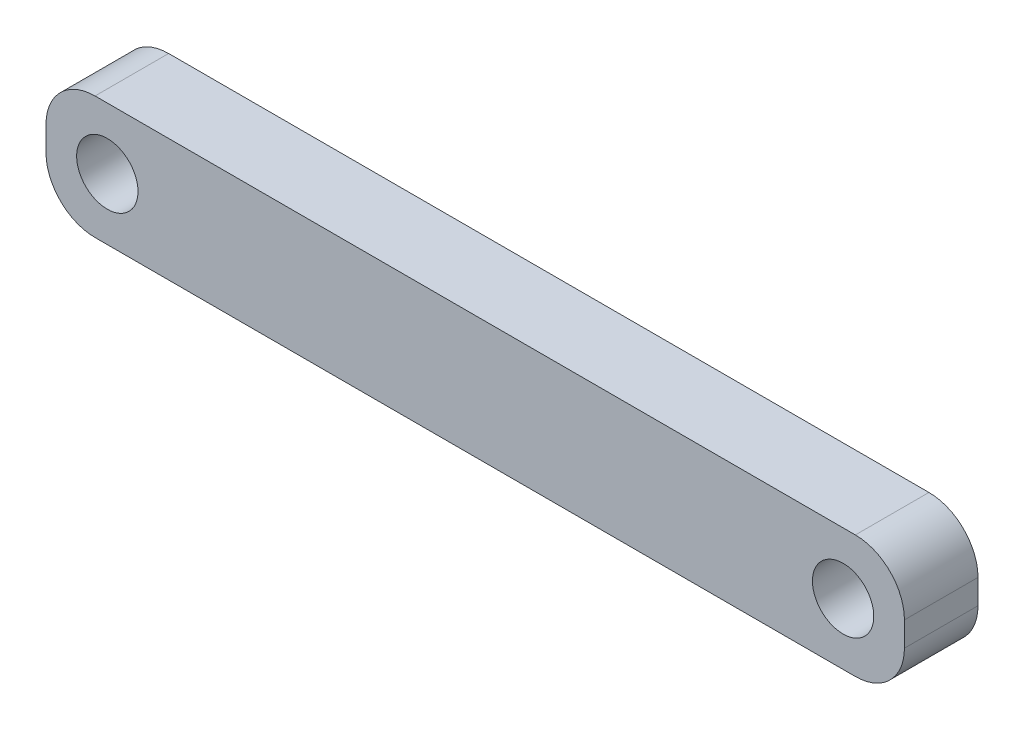
ISO-10303-21;
HEADER;
FILE_DESCRIPTION(('STEP AP214'),'2;1');
FILE_NAME('part.step','',(''),(''),'','','');
FILE_SCHEMA(('AUTOMOTIVE_DESIGN { 1 0 10303 214 1 1 1 1 }'));
ENDSEC;
DATA;
#1=APPLICATION_CONTEXT('core data for automotive mechanical design processes');
#2=APPLICATION_PROTOCOL_DEFINITION('international standard','automotive_design',2000,#1);
#3=PRODUCT_CONTEXT('',#1,'mechanical');
#4=PRODUCT('Part','Part','',(#3));
#5=PRODUCT_RELATED_PRODUCT_CATEGORY('part','',(#4));
#6=PRODUCT_DEFINITION_FORMATION('','',#4);
#7=PRODUCT_DEFINITION_CONTEXT('part definition',#1,'design');
#8=PRODUCT_DEFINITION('design','',#6,#7);
#9=PRODUCT_DEFINITION_SHAPE('','',#8);
#10=(LENGTH_UNIT() NAMED_UNIT(*) SI_UNIT(.MILLI.,.METRE.));
#11=(NAMED_UNIT(*) PLANE_ANGLE_UNIT() SI_UNIT($,.RADIAN.));
#12=(NAMED_UNIT(*) SI_UNIT($,.STERADIAN.) SOLID_ANGLE_UNIT());
#13=UNCERTAINTY_MEASURE_WITH_UNIT(LENGTH_MEASURE(1.E-05),#10,'distance_accuracy_value','');
#14=(GEOMETRIC_REPRESENTATION_CONTEXT(3) GLOBAL_UNCERTAINTY_ASSIGNED_CONTEXT((#13)) GLOBAL_UNIT_ASSIGNED_CONTEXT((#10,
#11,#12)) REPRESENTATION_CONTEXT('',''));
#15=CARTESIAN_POINT('',(0.,0.,0.));
#16=DIRECTION('',(0.,0.,1.));
#17=DIRECTION('',(1.,0.,0.));
#18=AXIS2_PLACEMENT_3D('',#15,#16,#17);
#19=CARTESIAN_POINT('',(31.,-1.,6.));
#20=DIRECTION('',(0.,0.,1.));
#21=DIRECTION('',(1.,0.,0.));
#22=AXIS2_PLACEMENT_3D('',#19,#20,#21);
#23=PLANE('',#22);
#24=CARTESIAN_POINT('',(-30.,0.,6.));
#25=DIRECTION('',(0.,0.,1.));
#26=DIRECTION('',(1.,0.,0.));
#27=AXIS2_PLACEMENT_3D('',#24,#25,#26);
#28=CIRCLE('',#27,2.5);
#29=CARTESIAN_POINT('',(-27.5,0.,6.));
#30=VERTEX_POINT('',#29);
#31=EDGE_CURVE('E140',#30,#30,#28,.T.);
#32=ORIENTED_EDGE('',*,*,#31,.F.);
#33=EDGE_LOOP('',(#32));
#34=FACE_BOUND('',#33,.T.);
#35=CARTESIAN_POINT('',(31.,-1.,6.));
#36=DIRECTION('',(0.,0.,1.));
#37=DIRECTION('',(1.,0.,0.));
#38=AXIS2_PLACEMENT_3D('',#35,#36,#37);
#39=CIRCLE('',#38,4.);
#40=CARTESIAN_POINT('',(31.,-5.,6.));
#41=VERTEX_POINT('',#40);
#42=CARTESIAN_POINT('',(35.,-0.999999999999974,6.));
#43=VERTEX_POINT('',#42);
#44=EDGE_CURVE('E151',#41,#43,#39,.T.);
#45=ORIENTED_EDGE('',*,*,#44,.T.);
#46=DIRECTION('',(0.,1.,0.));
#47=VECTOR('',#46,1.);
#48=CARTESIAN_POINT('',(35.,0.999999999999971,6.));
#49=LINE('',#48,#47);
#50=CARTESIAN_POINT('',(35.,0.999999999999972,6.));
#51=VERTEX_POINT('',#50);
#52=EDGE_CURVE('E99',#43,#51,#49,.T.);
#53=ORIENTED_EDGE('',*,*,#52,.T.);
#54=CARTESIAN_POINT('',(31.,1.,6.));
#55=DIRECTION('',(0.,0.,1.));
#56=DIRECTION('',(-1.,0.,0.));
#57=AXIS2_PLACEMENT_3D('',#54,#55,#56);
#58=CIRCLE('',#57,4.);
#59=CARTESIAN_POINT('',(31.,5.,6.));
#60=VERTEX_POINT('',#59);
#61=EDGE_CURVE('E166',#51,#60,#58,.T.);
#62=ORIENTED_EDGE('',*,*,#61,.T.);
#63=DIRECTION('',(-1.,0.,0.));
#64=VECTOR('',#63,1.);
#65=CARTESIAN_POINT('',(-31.,5.,6.));
#66=LINE('',#65,#64);
#67=CARTESIAN_POINT('',(-31.,5.,6.));
#68=VERTEX_POINT('',#67);
#69=EDGE_CURVE('E179',#60,#68,#66,.T.);
#70=ORIENTED_EDGE('',*,*,#69,.T.);
#71=CARTESIAN_POINT('',(-31.,1.,6.));
#72=DIRECTION('',(0.,0.,1.));
#73=DIRECTION('',(1.,0.,0.));
#74=AXIS2_PLACEMENT_3D('',#71,#72,#73);
#75=CIRCLE('',#74,4.);
#76=CARTESIAN_POINT('',(-35.,0.999999999999967,6.));
#77=VERTEX_POINT('',#76);
#78=EDGE_CURVE('E118',#68,#77,#75,.T.);
#79=ORIENTED_EDGE('',*,*,#78,.T.);
#80=DIRECTION('',(0.,-1.,0.));
#81=VECTOR('',#80,1.);
#82=CARTESIAN_POINT('',(-35.,0.999999999999967,6.));
#83=LINE('',#82,#81);
#84=CARTESIAN_POINT('',(-35.,-0.999999999999977,6.));
#85=VERTEX_POINT('',#84);
#86=EDGE_CURVE('E112',#77,#85,#83,.T.);
#87=ORIENTED_EDGE('',*,*,#86,.T.);
#88=CARTESIAN_POINT('',(-31.,-1.,6.));
#89=DIRECTION('',(0.,0.,1.));
#90=DIRECTION('',(1.,0.,0.));
#91=AXIS2_PLACEMENT_3D('',#88,#89,#90);
#92=CIRCLE('',#91,4.);
#93=CARTESIAN_POINT('',(-31.,-5.,6.));
#94=VERTEX_POINT('',#93);
#95=EDGE_CURVE('E116',#85,#94,#92,.T.);
#96=ORIENTED_EDGE('',*,*,#95,.T.);
#97=DIRECTION('',(1.,0.,0.));
#98=VECTOR('',#97,1.);
#99=CARTESIAN_POINT('',(-31.,-5.,6.));
#100=LINE('',#99,#98);
#101=EDGE_CURVE('E56',#94,#41,#100,.T.);
#102=ORIENTED_EDGE('',*,*,#101,.T.);
#103=EDGE_LOOP('',(#45,#53,#62,#70,#79,#87,#96,#102));
#104=FACE_BOUND('',#103,.T.);
#105=CARTESIAN_POINT('',(30.,0.,6.));
#106=DIRECTION('',(0.,0.,1.));
#107=DIRECTION('',(-1.,0.,0.));
#108=AXIS2_PLACEMENT_3D('',#105,#106,#107);
#109=CIRCLE('',#108,2.5);
#110=CARTESIAN_POINT('',(27.5,0.,6.));
#111=VERTEX_POINT('',#110);
#112=EDGE_CURVE('E188',#111,#111,#109,.T.);
#113=ORIENTED_EDGE('',*,*,#112,.F.);
#114=EDGE_LOOP('',(#113));
#115=FACE_BOUND('',#114,.T.);
#116=ADVANCED_FACE('F39',(#34,#104,#115),#23,.T.);
#117=CARTESIAN_POINT('',(31.,-1.,0.));
#118=DIRECTION('',(0.,0.,1.));
#119=DIRECTION('',(1.,0.,0.));
#120=AXIS2_PLACEMENT_3D('',#117,#118,#119);
#121=PLANE('',#120);
#122=CARTESIAN_POINT('',(31.,-1.,0.));
#123=DIRECTION('',(0.,0.,1.));
#124=DIRECTION('',(1.,0.,0.));
#125=AXIS2_PLACEMENT_3D('',#122,#123,#124);
#126=CIRCLE('',#125,4.);
#127=CARTESIAN_POINT('',(31.,-5.,0.));
#128=VERTEX_POINT('',#127);
#129=CARTESIAN_POINT('',(35.,-0.999999999999974,0.));
#130=VERTEX_POINT('',#129);
#131=EDGE_CURVE('E136',#128,#130,#126,.T.);
#132=ORIENTED_EDGE('',*,*,#131,.F.);
#133=DIRECTION('',(1.,0.,0.));
#134=VECTOR('',#133,1.);
#135=CARTESIAN_POINT('',(-31.,-5.,0.));
#136=LINE('',#135,#134);
#137=CARTESIAN_POINT('',(-31.,-5.,0.));
#138=VERTEX_POINT('',#137);
#139=EDGE_CURVE('E91',#138,#128,#136,.T.);
#140=ORIENTED_EDGE('',*,*,#139,.F.);
#141=CARTESIAN_POINT('',(-31.,-1.,0.));
#142=DIRECTION('',(0.,0.,1.));
#143=DIRECTION('',(1.,0.,0.));
#144=AXIS2_PLACEMENT_3D('',#141,#142,#143);
#145=CIRCLE('',#144,4.);
#146=CARTESIAN_POINT('',(-35.,-0.999999999999977,0.));
#147=VERTEX_POINT('',#146);
#148=EDGE_CURVE('E85',#147,#138,#145,.T.);
#149=ORIENTED_EDGE('',*,*,#148,.F.);
#150=DIRECTION('',(0.,-1.,0.));
#151=VECTOR('',#150,1.);
#152=CARTESIAN_POINT('',(-35.,0.999999999999967,0.));
#153=LINE('',#152,#151);
#154=CARTESIAN_POINT('',(-35.,0.999999999999967,0.));
#155=VERTEX_POINT('',#154);
#156=EDGE_CURVE('E126',#155,#147,#153,.T.);
#157=ORIENTED_EDGE('',*,*,#156,.F.);
#158=CARTESIAN_POINT('',(-31.,1.,0.));
#159=DIRECTION('',(0.,0.,1.));
#160=DIRECTION('',(1.,0.,0.));
#161=AXIS2_PLACEMENT_3D('',#158,#159,#160);
#162=CIRCLE('',#161,4.);
#163=CARTESIAN_POINT('',(-31.,5.,0.));
#164=VERTEX_POINT('',#163);
#165=EDGE_CURVE('E146',#164,#155,#162,.T.);
#166=ORIENTED_EDGE('',*,*,#165,.F.);
#167=DIRECTION('',(-1.,0.,0.));
#168=VECTOR('',#167,1.);
#169=CARTESIAN_POINT('',(-31.,5.,0.));
#170=LINE('',#169,#168);
#171=CARTESIAN_POINT('',(31.,5.,0.));
#172=VERTEX_POINT('',#171);
#173=EDGE_CURVE('E144',#172,#164,#170,.T.);
#174=ORIENTED_EDGE('',*,*,#173,.F.);
#175=CARTESIAN_POINT('',(31.,1.,0.));
#176=DIRECTION('',(0.,0.,1.));
#177=DIRECTION('',(-1.,0.,0.));
#178=AXIS2_PLACEMENT_3D('',#175,#176,#177);
#179=CIRCLE('',#178,4.);
#180=CARTESIAN_POINT('',(35.,0.999999999999972,0.));
#181=VERTEX_POINT('',#180);
#182=EDGE_CURVE('E142',#181,#172,#179,.T.);
#183=ORIENTED_EDGE('',*,*,#182,.F.);
#184=DIRECTION('',(0.,1.,0.));
#185=VECTOR('',#184,1.);
#186=CARTESIAN_POINT('',(35.,0.999999999999971,0.));
#187=LINE('',#186,#185);
#188=EDGE_CURVE('E139',#130,#181,#187,.T.);
#189=ORIENTED_EDGE('',*,*,#188,.F.);
#190=EDGE_LOOP('',(#132,#140,#149,#157,#166,#174,#183,#189));
#191=FACE_BOUND('',#190,.T.);
#192=CARTESIAN_POINT('',(-30.,0.,0.));
#193=DIRECTION('',(0.,0.,1.));
#194=DIRECTION('',(1.,0.,0.));
#195=AXIS2_PLACEMENT_3D('',#192,#193,#194);
#196=CIRCLE('',#195,2.5);
#197=CARTESIAN_POINT('',(-27.5,0.,0.));
#198=VERTEX_POINT('',#197);
#199=EDGE_CURVE('E185',#198,#198,#196,.T.);
#200=ORIENTED_EDGE('',*,*,#199,.T.);
#201=EDGE_LOOP('',(#200));
#202=FACE_BOUND('',#201,.T.);
#203=CARTESIAN_POINT('',(30.,0.,0.));
#204=DIRECTION('',(0.,0.,1.));
#205=DIRECTION('',(-1.,0.,0.));
#206=AXIS2_PLACEMENT_3D('',#203,#204,#205);
#207=CIRCLE('',#206,2.5);
#208=CARTESIAN_POINT('',(27.5,0.,0.));
#209=VERTEX_POINT('',#208);
#210=EDGE_CURVE('E191',#209,#209,#207,.T.);
#211=ORIENTED_EDGE('',*,*,#210,.T.);
#212=EDGE_LOOP('',(#211));
#213=FACE_BOUND('',#212,.T.);
#214=ADVANCED_FACE('F170',(#191,#202,#213),#121,.F.);
#215=CARTESIAN_POINT('',(31.,-1.,6.));
#216=DIRECTION('',(0.,0.,-1.));
#217=DIRECTION('',(-1.,0.,0.));
#218=AXIS2_PLACEMENT_3D('',#215,#216,#217);
#219=CYLINDRICAL_SURFACE('',#218,4.);
#220=ORIENTED_EDGE('',*,*,#131,.T.);
#221=DIRECTION('',(0.,0.,-1.));
#222=VECTOR('',#221,1.);
#223=CARTESIAN_POINT('',(35.,-0.999999999999974,6.));
#224=LINE('',#223,#222);
#225=EDGE_CURVE('E11',#43,#130,#224,.T.);
#226=ORIENTED_EDGE('',*,*,#225,.F.);
#227=ORIENTED_EDGE('',*,*,#44,.F.);
#228=DIRECTION('',(0.,0.,-1.));
#229=VECTOR('',#228,1.);
#230=CARTESIAN_POINT('',(31.,-5.,6.));
#231=LINE('',#230,#229);
#232=EDGE_CURVE('E132',#41,#128,#231,.T.);
#233=ORIENTED_EDGE('',*,*,#232,.T.);
#234=EDGE_LOOP('',(#220,#226,#227,#233));
#235=FACE_BOUND('',#234,.T.);
#236=ADVANCED_FACE('F41',(#235),#219,.T.);
#237=CARTESIAN_POINT('',(35.,0.999999999999971,6.));
#238=DIRECTION('',(-1.,0.,0.));
#239=DIRECTION('',(0.,0.,1.));
#240=AXIS2_PLACEMENT_3D('',#237,#238,#239);
#241=PLANE('',#240);
#242=ORIENTED_EDGE('',*,*,#188,.T.);
#243=DIRECTION('',(0.,0.,-1.));
#244=VECTOR('',#243,1.);
#245=CARTESIAN_POINT('',(35.,0.999999999999972,6.));
#246=LINE('',#245,#244);
#247=EDGE_CURVE('E48',#51,#181,#246,.T.);
#248=ORIENTED_EDGE('',*,*,#247,.F.);
#249=ORIENTED_EDGE('',*,*,#52,.F.);
#250=ORIENTED_EDGE('',*,*,#225,.T.);
#251=EDGE_LOOP('',(#242,#248,#249,#250));
#252=FACE_BOUND('',#251,.T.);
#253=ADVANCED_FACE('F223',(#252),#241,.F.);
#254=CARTESIAN_POINT('',(31.,1.,6.));
#255=DIRECTION('',(0.,0.,-1.));
#256=DIRECTION('',(-1.,0.,0.));
#257=AXIS2_PLACEMENT_3D('',#254,#255,#256);
#258=CYLINDRICAL_SURFACE('',#257,4.);
#259=ORIENTED_EDGE('',*,*,#182,.T.);
#260=DIRECTION('',(0.,0.,-1.));
#261=VECTOR('',#260,1.);
#262=CARTESIAN_POINT('',(31.,5.,6.));
#263=LINE('',#262,#261);
#264=EDGE_CURVE('E158',#60,#172,#263,.T.);
#265=ORIENTED_EDGE('',*,*,#264,.F.);
#266=ORIENTED_EDGE('',*,*,#61,.F.);
#267=ORIENTED_EDGE('',*,*,#247,.T.);
#268=EDGE_LOOP('',(#259,#265,#266,#267));
#269=FACE_BOUND('',#268,.T.);
#270=ADVANCED_FACE('F164',(#269),#258,.T.);
#271=CARTESIAN_POINT('',(-31.,5.,6.));
#272=DIRECTION('',(0.,-1.,0.));
#273=DIRECTION('',(0.,0.,-1.));
#274=AXIS2_PLACEMENT_3D('',#271,#272,#273);
#275=PLANE('',#274);
#276=ORIENTED_EDGE('',*,*,#173,.T.);
#277=DIRECTION('',(0.,0.,-1.));
#278=VECTOR('',#277,1.);
#279=CARTESIAN_POINT('',(-31.,5.,6.));
#280=LINE('',#279,#278);
#281=EDGE_CURVE('E155',#68,#164,#280,.T.);
#282=ORIENTED_EDGE('',*,*,#281,.F.);
#283=ORIENTED_EDGE('',*,*,#69,.F.);
#284=ORIENTED_EDGE('',*,*,#264,.T.);
#285=EDGE_LOOP('',(#276,#282,#283,#284));
#286=FACE_BOUND('',#285,.T.);
#287=ADVANCED_FACE('F175',(#286),#275,.F.);
#288=CARTESIAN_POINT('',(-31.,1.,6.));
#289=DIRECTION('',(0.,0.,-1.));
#290=DIRECTION('',(-1.,0.,0.));
#291=AXIS2_PLACEMENT_3D('',#288,#289,#290);
#292=CYLINDRICAL_SURFACE('',#291,4.);
#293=ORIENTED_EDGE('',*,*,#165,.T.);
#294=DIRECTION('',(0.,0.,-1.));
#295=VECTOR('',#294,1.);
#296=CARTESIAN_POINT('',(-35.,0.999999999999967,6.));
#297=LINE('',#296,#295);
#298=EDGE_CURVE('E127',#77,#155,#297,.T.);
#299=ORIENTED_EDGE('',*,*,#298,.F.);
#300=ORIENTED_EDGE('',*,*,#78,.F.);
#301=ORIENTED_EDGE('',*,*,#281,.T.);
#302=EDGE_LOOP('',(#293,#299,#300,#301));
#303=FACE_BOUND('',#302,.T.);
#304=ADVANCED_FACE('F178',(#303),#292,.T.);
#305=CARTESIAN_POINT('',(-35.,0.999999999999967,6.));
#306=DIRECTION('',(1.,0.,0.));
#307=DIRECTION('',(0.,0.,-1.));
#308=AXIS2_PLACEMENT_3D('',#305,#306,#307);
#309=PLANE('',#308);
#310=ORIENTED_EDGE('',*,*,#156,.T.);
#311=DIRECTION('',(0.,0.,-1.));
#312=VECTOR('',#311,1.);
#313=CARTESIAN_POINT('',(-35.,-0.999999999999977,6.));
#314=LINE('',#313,#312);
#315=EDGE_CURVE('E123',#85,#147,#314,.T.);
#316=ORIENTED_EDGE('',*,*,#315,.F.);
#317=ORIENTED_EDGE('',*,*,#86,.F.);
#318=ORIENTED_EDGE('',*,*,#298,.T.);
#319=EDGE_LOOP('',(#310,#316,#317,#318));
#320=FACE_BOUND('',#319,.T.);
#321=ADVANCED_FACE('F124',(#320),#309,.F.);
#322=CARTESIAN_POINT('',(-31.,-1.,6.));
#323=DIRECTION('',(0.,0.,-1.));
#324=DIRECTION('',(-1.,0.,0.));
#325=AXIS2_PLACEMENT_3D('',#322,#323,#324);
#326=CYLINDRICAL_SURFACE('',#325,4.);
#327=ORIENTED_EDGE('',*,*,#148,.T.);
#328=DIRECTION('',(0.,0.,-1.));
#329=VECTOR('',#328,1.);
#330=CARTESIAN_POINT('',(-31.,-5.,6.));
#331=LINE('',#330,#329);
#332=EDGE_CURVE('E128',#94,#138,#331,.T.);
#333=ORIENTED_EDGE('',*,*,#332,.F.);
#334=ORIENTED_EDGE('',*,*,#95,.F.);
#335=ORIENTED_EDGE('',*,*,#315,.T.);
#336=EDGE_LOOP('',(#327,#333,#334,#335));
#337=FACE_BOUND('',#336,.T.);
#338=ADVANCED_FACE('F130',(#337),#326,.T.);
#339=CARTESIAN_POINT('',(-31.,-5.,6.));
#340=DIRECTION('',(0.,1.,0.));
#341=DIRECTION('',(0.,0.,1.));
#342=AXIS2_PLACEMENT_3D('',#339,#340,#341);
#343=PLANE('',#342);
#344=ORIENTED_EDGE('',*,*,#139,.T.);
#345=ORIENTED_EDGE('',*,*,#232,.F.);
#346=ORIENTED_EDGE('',*,*,#101,.F.);
#347=ORIENTED_EDGE('',*,*,#332,.T.);
#348=EDGE_LOOP('',(#344,#345,#346,#347));
#349=FACE_BOUND('',#348,.T.);
#350=ADVANCED_FACE('F211',(#349),#343,.F.);
#351=CARTESIAN_POINT('',(-30.,0.,6.));
#352=DIRECTION('',(0.,0.,-1.));
#353=DIRECTION('',(-1.,0.,0.));
#354=AXIS2_PLACEMENT_3D('',#351,#352,#353);
#355=CYLINDRICAL_SURFACE('',#354,2.5);
#356=ORIENTED_EDGE('',*,*,#31,.T.);
#357=EDGE_LOOP('',(#356));
#358=FACE_BOUND('',#357,.T.);
#359=ORIENTED_EDGE('',*,*,#199,.F.);
#360=EDGE_LOOP('',(#359));
#361=FACE_BOUND('',#360,.T.);
#362=ADVANCED_FACE('F208',(#358,#361),#355,.F.);
#363=CARTESIAN_POINT('',(30.,0.,6.));
#364=DIRECTION('',(0.,0.,-1.));
#365=DIRECTION('',(-1.,0.,0.));
#366=AXIS2_PLACEMENT_3D('',#363,#364,#365);
#367=CYLINDRICAL_SURFACE('',#366,2.5);
#368=ORIENTED_EDGE('',*,*,#112,.T.);
#369=EDGE_LOOP('',(#368));
#370=FACE_BOUND('',#369,.T.);
#371=ORIENTED_EDGE('',*,*,#210,.F.);
#372=EDGE_LOOP('',(#371));
#373=FACE_BOUND('',#372,.T.);
#374=ADVANCED_FACE('F197',(#370,#373),#367,.F.);
#375=CLOSED_SHELL('',(#116,#214,#236,#253,#270,#287,#304,#321,#338,#350,#362,#374));
#376=MANIFOLD_SOLID_BREP('B2',#375);
#377=ADVANCED_BREP_SHAPE_REPRESENTATION('',(#18,#376),#14);
#378=SHAPE_DEFINITION_REPRESENTATION(#9,#377);
ENDSEC;
END-ISO-10303-21;
